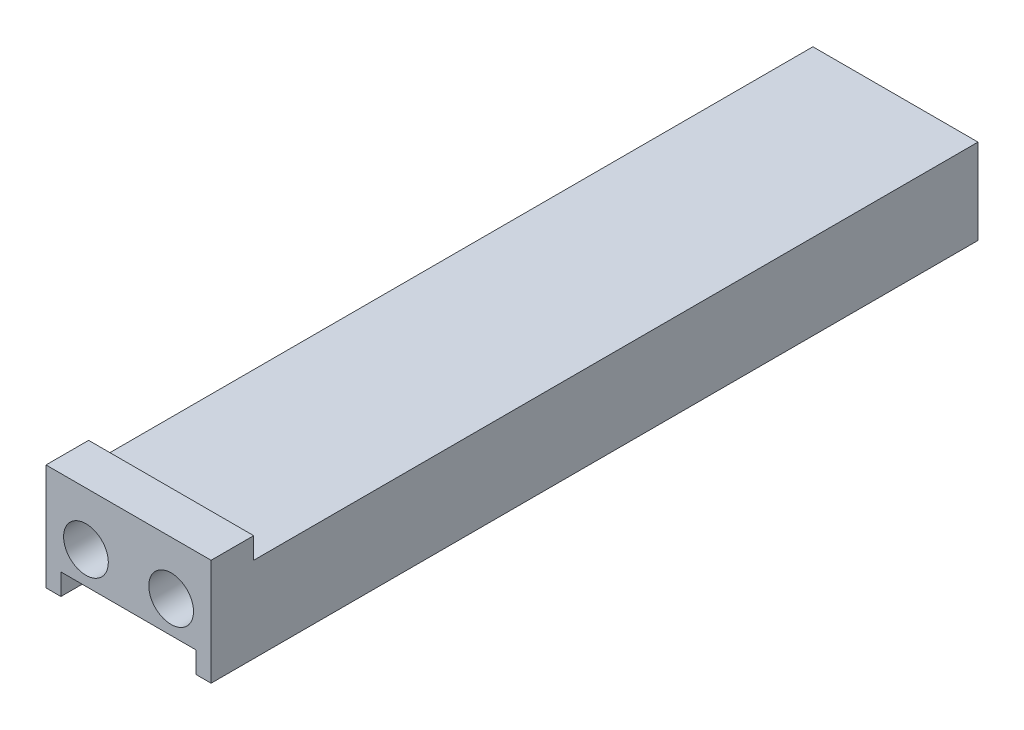
ISO-10303-21;
HEADER;
FILE_DESCRIPTION(('STEP AP214'),'2;1');
FILE_NAME('part.step','',(''),(''),'','','');
FILE_SCHEMA(('AUTOMOTIVE_DESIGN { 1 0 10303 214 1 1 1 1 }'));
ENDSEC;
DATA;
#1=APPLICATION_CONTEXT('core data for automotive mechanical design processes');
#2=APPLICATION_PROTOCOL_DEFINITION('international standard','automotive_design',2000,#1);
#3=PRODUCT_CONTEXT('',#1,'mechanical');
#4=PRODUCT('Part','Part','',(#3));
#5=PRODUCT_RELATED_PRODUCT_CATEGORY('part','',(#4));
#6=PRODUCT_DEFINITION_FORMATION('','',#4);
#7=PRODUCT_DEFINITION_CONTEXT('part definition',#1,'design');
#8=PRODUCT_DEFINITION('design','',#6,#7);
#9=PRODUCT_DEFINITION_SHAPE('','',#8);
#10=(LENGTH_UNIT() NAMED_UNIT(*) SI_UNIT(.MILLI.,.METRE.));
#11=(NAMED_UNIT(*) PLANE_ANGLE_UNIT() SI_UNIT($,.RADIAN.));
#12=(NAMED_UNIT(*) SI_UNIT($,.STERADIAN.) SOLID_ANGLE_UNIT());
#13=UNCERTAINTY_MEASURE_WITH_UNIT(LENGTH_MEASURE(1.E-05),#10,'distance_accuracy_value','');
#14=(GEOMETRIC_REPRESENTATION_CONTEXT(3) GLOBAL_UNCERTAINTY_ASSIGNED_CONTEXT((#13)) GLOBAL_UNIT_ASSIGNED_CONTEXT((#10,
#11,#12)) REPRESENTATION_CONTEXT('',''));
#15=CARTESIAN_POINT('',(0.,0.,0.));
#16=DIRECTION('',(0.,0.,1.));
#17=DIRECTION('',(1.,0.,0.));
#18=AXIS2_PLACEMENT_3D('',#15,#16,#17);
#19=CARTESIAN_POINT('',(0.,8.,72.));
#20=DIRECTION('',(0.,-1.,0.));
#21=DIRECTION('',(0.,0.,-1.));
#22=AXIS2_PLACEMENT_3D('',#19,#20,#21);
#23=PLANE('',#22);
#24=DIRECTION('',(-1.,0.,0.));
#25=VECTOR('',#24,1.);
#26=CARTESIAN_POINT('',(0.,8.,68.));
#27=LINE('',#26,#25);
#28=CARTESIAN_POINT('',(15.5,8.,68.));
#29=VERTEX_POINT('',#28);
#30=CARTESIAN_POINT('',(0.,8.,68.));
#31=VERTEX_POINT('',#30);
#32=EDGE_CURVE('E50',#29,#31,#27,.T.);
#33=ORIENTED_EDGE('',*,*,#32,.F.);
#34=DIRECTION('',(0.,0.,-1.));
#35=VECTOR('',#34,1.);
#36=CARTESIAN_POINT('',(15.5,8.,72.));
#37=LINE('',#36,#35);
#38=CARTESIAN_POINT('',(15.5,8.,0.));
#39=VERTEX_POINT('',#38);
#40=EDGE_CURVE('E155',#29,#39,#37,.T.);
#41=ORIENTED_EDGE('',*,*,#40,.T.);
#42=DIRECTION('',(-1.,0.,0.));
#43=VECTOR('',#42,1.);
#44=CARTESIAN_POINT('',(0.,8.,0.));
#45=LINE('',#44,#43);
#46=CARTESIAN_POINT('',(0.,8.,0.));
#47=VERTEX_POINT('',#46);
#48=EDGE_CURVE('E123',#39,#47,#45,.T.);
#49=ORIENTED_EDGE('',*,*,#48,.T.);
#50=DIRECTION('',(0.,0.,-1.));
#51=VECTOR('',#50,1.);
#52=CARTESIAN_POINT('',(0.,8.,72.));
#53=LINE('',#52,#51);
#54=EDGE_CURVE('E188',#31,#47,#53,.T.);
#55=ORIENTED_EDGE('',*,*,#54,.F.);
#56=EDGE_LOOP('',(#33,#41,#49,#55));
#57=FACE_BOUND('',#56,.T.);
#58=ADVANCED_FACE('F33',(#57),#23,.F.);
#59=CARTESIAN_POINT('',(0.,0.,72.));
#60=DIRECTION('',(0.,1.,0.));
#61=DIRECTION('',(0.,0.,1.));
#62=AXIS2_PLACEMENT_3D('',#59,#60,#61);
#63=PLANE('',#62);
#64=DIRECTION('',(1.,0.,0.));
#65=VECTOR('',#64,1.);
#66=CARTESIAN_POINT('',(0.,0.,72.));
#67=LINE('',#66,#65);
#68=CARTESIAN_POINT('',(14.1,0.,72.));
#69=VERTEX_POINT('',#68);
#70=CARTESIAN_POINT('',(15.5,0.,72.));
#71=VERTEX_POINT('',#70);
#72=EDGE_CURVE('E122',#69,#71,#67,.T.);
#73=ORIENTED_EDGE('',*,*,#72,.F.);
#74=DIRECTION('',(0.,0.,-1.));
#75=VECTOR('',#74,1.);
#76=CARTESIAN_POINT('',(14.1,0.,72.));
#77=LINE('',#76,#75);
#78=CARTESIAN_POINT('',(14.1,0.,0.));
#79=VERTEX_POINT('',#78);
#80=EDGE_CURVE('E183',#69,#79,#77,.T.);
#81=ORIENTED_EDGE('',*,*,#80,.T.);
#82=DIRECTION('',(1.,0.,0.));
#83=VECTOR('',#82,1.);
#84=CARTESIAN_POINT('',(0.,0.,0.));
#85=LINE('',#84,#83);
#86=CARTESIAN_POINT('',(15.5,0.,0.));
#87=VERTEX_POINT('',#86);
#88=EDGE_CURVE('E190',#79,#87,#85,.T.);
#89=ORIENTED_EDGE('',*,*,#88,.T.);
#90=DIRECTION('',(0.,0.,-1.));
#91=VECTOR('',#90,1.);
#92=CARTESIAN_POINT('',(15.5,0.,72.));
#93=LINE('',#92,#91);
#94=EDGE_CURVE('E42',#71,#87,#93,.T.);
#95=ORIENTED_EDGE('',*,*,#94,.F.);
#96=EDGE_LOOP('',(#73,#81,#89,#95));
#97=FACE_BOUND('',#96,.T.);
#98=ADVANCED_FACE('F226',(#97),#63,.F.);
#99=CARTESIAN_POINT('',(0.,0.,72.));
#100=DIRECTION('',(1.,0.,0.));
#101=DIRECTION('',(0.,0.,-1.));
#102=AXIS2_PLACEMENT_3D('',#99,#100,#101);
#103=PLANE('',#102);
#104=DIRECTION('',(0.,-1.,0.));
#105=VECTOR('',#104,1.);
#106=CARTESIAN_POINT('',(0.,0.,0.));
#107=LINE('',#106,#105);
#108=CARTESIAN_POINT('',(0.,0.,0.));
#109=VERTEX_POINT('',#108);
#110=EDGE_CURVE('E179',#47,#109,#107,.T.);
#111=ORIENTED_EDGE('',*,*,#110,.T.);
#112=DIRECTION('',(0.,0.,-1.));
#113=VECTOR('',#112,1.);
#114=CARTESIAN_POINT('',(0.,0.,72.));
#115=LINE('',#114,#113);
#116=CARTESIAN_POINT('',(0.,0.,72.));
#117=VERTEX_POINT('',#116);
#118=EDGE_CURVE('E11',#117,#109,#115,.T.);
#119=ORIENTED_EDGE('',*,*,#118,.F.);
#120=DIRECTION('',(0.,-1.,0.));
#121=VECTOR('',#120,1.);
#122=CARTESIAN_POINT('',(0.,0.,72.));
#123=LINE('',#122,#121);
#124=CARTESIAN_POINT('',(0.,10.,72.));
#125=VERTEX_POINT('',#124);
#126=EDGE_CURVE('E114',#125,#117,#123,.T.);
#127=ORIENTED_EDGE('',*,*,#126,.F.);
#128=DIRECTION('',(0.,0.,1.));
#129=VECTOR('',#128,1.);
#130=CARTESIAN_POINT('',(0.,10.,72.));
#131=LINE('',#130,#129);
#132=CARTESIAN_POINT('',(0.,10.,68.));
#133=VERTEX_POINT('',#132);
#134=EDGE_CURVE('E119',#133,#125,#131,.T.);
#135=ORIENTED_EDGE('',*,*,#134,.F.);
#136=DIRECTION('',(0.,-1.,0.));
#137=VECTOR('',#136,1.);
#138=CARTESIAN_POINT('',(0.,10.,68.));
#139=LINE('',#138,#137);
#140=EDGE_CURVE('E148',#133,#31,#139,.T.);
#141=ORIENTED_EDGE('',*,*,#140,.T.);
#142=ORIENTED_EDGE('',*,*,#54,.T.);
#143=EDGE_LOOP('',(#111,#119,#127,#135,#141,#142));
#144=FACE_BOUND('',#143,.T.);
#145=ADVANCED_FACE('F35',(#144),#103,.F.);
#146=CARTESIAN_POINT('',(1.4,0.,0.));
#147=VERTEX_POINT('',#146);
#148=EDGE_CURVE('E191',#109,#147,#85,.T.);
#149=ORIENTED_EDGE('',*,*,#148,.T.);
#150=DIRECTION('',(0.,0.,-1.));
#151=VECTOR('',#150,1.);
#152=CARTESIAN_POINT('',(1.4,0.,72.));
#153=LINE('',#152,#151);
#154=CARTESIAN_POINT('',(1.4,0.,72.));
#155=VERTEX_POINT('',#154);
#156=EDGE_CURVE('E58',#155,#147,#153,.T.);
#157=ORIENTED_EDGE('',*,*,#156,.F.);
#158=EDGE_CURVE('E185',#117,#155,#67,.T.);
#159=ORIENTED_EDGE('',*,*,#158,.F.);
#160=ORIENTED_EDGE('',*,*,#118,.T.);
#161=EDGE_LOOP('',(#149,#157,#159,#160));
#162=FACE_BOUND('',#161,.T.);
#163=ADVANCED_FACE('F232',(#162),#63,.F.);
#164=CARTESIAN_POINT('',(15.5,0.,72.));
#165=DIRECTION('',(-1.,0.,0.));
#166=DIRECTION('',(0.,0.,1.));
#167=AXIS2_PLACEMENT_3D('',#164,#165,#166);
#168=PLANE('',#167);
#169=DIRECTION('',(0.,1.,0.));
#170=VECTOR('',#169,1.);
#171=CARTESIAN_POINT('',(15.5,0.,0.));
#172=LINE('',#171,#170);
#173=EDGE_CURVE('E194',#87,#39,#172,.T.);
#174=ORIENTED_EDGE('',*,*,#173,.T.);
#175=ORIENTED_EDGE('',*,*,#40,.F.);
#176=DIRECTION('',(0.,-1.,0.));
#177=VECTOR('',#176,1.);
#178=CARTESIAN_POINT('',(15.5,10.,68.));
#179=LINE('',#178,#177);
#180=CARTESIAN_POINT('',(15.5,10.,68.));
#181=VERTEX_POINT('',#180);
#182=EDGE_CURVE('E159',#181,#29,#179,.T.);
#183=ORIENTED_EDGE('',*,*,#182,.F.);
#184=DIRECTION('',(0.,0.,-1.));
#185=VECTOR('',#184,1.);
#186=CARTESIAN_POINT('',(15.5,10.,72.));
#187=LINE('',#186,#185);
#188=CARTESIAN_POINT('',(15.5,10.,72.));
#189=VERTEX_POINT('',#188);
#190=EDGE_CURVE('E133',#189,#181,#187,.T.);
#191=ORIENTED_EDGE('',*,*,#190,.F.);
#192=DIRECTION('',(0.,1.,0.));
#193=VECTOR('',#192,1.);
#194=CARTESIAN_POINT('',(15.5,0.,72.));
#195=LINE('',#194,#193);
#196=EDGE_CURVE('E130',#71,#189,#195,.T.);
#197=ORIENTED_EDGE('',*,*,#196,.F.);
#198=ORIENTED_EDGE('',*,*,#94,.T.);
#199=EDGE_LOOP('',(#174,#175,#183,#191,#197,#198));
#200=FACE_BOUND('',#199,.T.);
#201=ADVANCED_FACE('F208',(#200),#168,.F.);
#202=CARTESIAN_POINT('',(0.,8.,72.));
#203=DIRECTION('',(0.,0.,-1.));
#204=DIRECTION('',(-1.,0.,0.));
#205=AXIS2_PLACEMENT_3D('',#202,#203,#204);
#206=PLANE('',#205);
#207=CARTESIAN_POINT('',(11.75,5.,72.));
#208=DIRECTION('',(0.,0.,1.));
#209=DIRECTION('',(-1.,0.,0.));
#210=AXIS2_PLACEMENT_3D('',#207,#208,#209);
#211=CIRCLE('',#210,2.1);
#212=CARTESIAN_POINT('',(9.65,5.,72.));
#213=VERTEX_POINT('',#212);
#214=EDGE_CURVE('E264',#213,#213,#211,.T.);
#215=ORIENTED_EDGE('',*,*,#214,.F.);
#216=EDGE_LOOP('',(#215));
#217=FACE_BOUND('',#216,.T.);
#218=CARTESIAN_POINT('',(3.75,5.,72.));
#219=DIRECTION('',(0.,0.,1.));
#220=DIRECTION('',(1.,0.,0.));
#221=AXIS2_PLACEMENT_3D('',#218,#219,#220);
#222=CIRCLE('',#221,2.1);
#223=CARTESIAN_POINT('',(5.85,5.,72.));
#224=VERTEX_POINT('',#223);
#225=EDGE_CURVE('E143',#224,#224,#222,.T.);
#226=ORIENTED_EDGE('',*,*,#225,.F.);
#227=EDGE_LOOP('',(#226));
#228=FACE_BOUND('',#227,.T.);
#229=DIRECTION('',(1.,0.,0.));
#230=VECTOR('',#229,1.);
#231=CARTESIAN_POINT('',(14.1,2.,72.));
#232=LINE('',#231,#230);
#233=CARTESIAN_POINT('',(1.4,2.,72.));
#234=VERTEX_POINT('',#233);
#235=CARTESIAN_POINT('',(14.1,2.,72.));
#236=VERTEX_POINT('',#235);
#237=EDGE_CURVE('E173',#234,#236,#232,.T.);
#238=ORIENTED_EDGE('',*,*,#237,.T.);
#239=DIRECTION('',(0.,-1.,0.));
#240=VECTOR('',#239,1.);
#241=CARTESIAN_POINT('',(14.1,0.,72.));
#242=LINE('',#241,#240);
#243=EDGE_CURVE('E151',#236,#69,#242,.T.);
#244=ORIENTED_EDGE('',*,*,#243,.T.);
#245=ORIENTED_EDGE('',*,*,#72,.T.);
#246=ORIENTED_EDGE('',*,*,#196,.T.);
#247=DIRECTION('',(1.,0.,0.));
#248=VECTOR('',#247,1.);
#249=CARTESIAN_POINT('',(0.,10.,72.));
#250=LINE('',#249,#248);
#251=EDGE_CURVE('E126',#125,#189,#250,.T.);
#252=ORIENTED_EDGE('',*,*,#251,.F.);
#253=ORIENTED_EDGE('',*,*,#126,.T.);
#254=ORIENTED_EDGE('',*,*,#158,.T.);
#255=DIRECTION('',(0.,1.,0.));
#256=VECTOR('',#255,1.);
#257=CARTESIAN_POINT('',(1.4,0.,72.));
#258=LINE('',#257,#256);
#259=EDGE_CURVE('E243',#155,#234,#258,.T.);
#260=ORIENTED_EDGE('',*,*,#259,.T.);
#261=EDGE_LOOP('',(#238,#244,#245,#246,#252,#253,#254,#260));
#262=FACE_BOUND('',#261,.T.);
#263=ADVANCED_FACE('F128',(#217,#228,#262),#206,.F.);
#264=CARTESIAN_POINT('',(0.,8.,0.));
#265=DIRECTION('',(0.,0.,-1.));
#266=DIRECTION('',(-1.,0.,0.));
#267=AXIS2_PLACEMENT_3D('',#264,#265,#266);
#268=PLANE('',#267);
#269=DIRECTION('',(0.,-1.,0.));
#270=VECTOR('',#269,1.);
#271=CARTESIAN_POINT('',(14.1,0.,0.));
#272=LINE('',#271,#270);
#273=CARTESIAN_POINT('',(14.1,2.,0.));
#274=VERTEX_POINT('',#273);
#275=EDGE_CURVE('E162',#274,#79,#272,.T.);
#276=ORIENTED_EDGE('',*,*,#275,.F.);
#277=DIRECTION('',(1.,0.,0.));
#278=VECTOR('',#277,1.);
#279=CARTESIAN_POINT('',(14.1,2.,0.));
#280=LINE('',#279,#278);
#281=CARTESIAN_POINT('',(1.4,2.,0.));
#282=VERTEX_POINT('',#281);
#283=EDGE_CURVE('E170',#282,#274,#280,.T.);
#284=ORIENTED_EDGE('',*,*,#283,.F.);
#285=DIRECTION('',(0.,1.,0.));
#286=VECTOR('',#285,1.);
#287=CARTESIAN_POINT('',(1.4,0.,0.));
#288=LINE('',#287,#286);
#289=EDGE_CURVE('E165',#147,#282,#288,.T.);
#290=ORIENTED_EDGE('',*,*,#289,.F.);
#291=ORIENTED_EDGE('',*,*,#148,.F.);
#292=ORIENTED_EDGE('',*,*,#110,.F.);
#293=ORIENTED_EDGE('',*,*,#48,.F.);
#294=ORIENTED_EDGE('',*,*,#173,.F.);
#295=ORIENTED_EDGE('',*,*,#88,.F.);
#296=EDGE_LOOP('',(#276,#284,#290,#291,#292,#293,#294,#295));
#297=FACE_BOUND('',#296,.T.);
#298=ADVANCED_FACE('F211',(#297),#268,.T.);
#299=CARTESIAN_POINT('',(14.1,0.,72.));
#300=DIRECTION('',(1.,0.,0.));
#301=DIRECTION('',(0.,0.,-1.));
#302=AXIS2_PLACEMENT_3D('',#299,#300,#301);
#303=PLANE('',#302);
#304=ORIENTED_EDGE('',*,*,#275,.T.);
#305=ORIENTED_EDGE('',*,*,#80,.F.);
#306=ORIENTED_EDGE('',*,*,#243,.F.);
#307=DIRECTION('',(0.,0.,-1.));
#308=VECTOR('',#307,1.);
#309=CARTESIAN_POINT('',(14.1,2.,72.));
#310=LINE('',#309,#308);
#311=EDGE_CURVE('E177',#236,#274,#310,.T.);
#312=ORIENTED_EDGE('',*,*,#311,.T.);
#313=EDGE_LOOP('',(#304,#305,#306,#312));
#314=FACE_BOUND('',#313,.T.);
#315=ADVANCED_FACE('F250',(#314),#303,.F.);
#316=CARTESIAN_POINT('',(14.1,2.,72.));
#317=DIRECTION('',(0.,1.,0.));
#318=DIRECTION('',(0.,0.,1.));
#319=AXIS2_PLACEMENT_3D('',#316,#317,#318);
#320=PLANE('',#319);
#321=ORIENTED_EDGE('',*,*,#283,.T.);
#322=ORIENTED_EDGE('',*,*,#311,.F.);
#323=ORIENTED_EDGE('',*,*,#237,.F.);
#324=DIRECTION('',(0.,0.,-1.));
#325=VECTOR('',#324,1.);
#326=CARTESIAN_POINT('',(1.4,2.,72.));
#327=LINE('',#326,#325);
#328=EDGE_CURVE('E180',#234,#282,#327,.T.);
#329=ORIENTED_EDGE('',*,*,#328,.T.);
#330=EDGE_LOOP('',(#321,#322,#323,#329));
#331=FACE_BOUND('',#330,.T.);
#332=ADVANCED_FACE('F222',(#331),#320,.F.);
#333=CARTESIAN_POINT('',(1.4,0.,72.));
#334=DIRECTION('',(-1.,0.,0.));
#335=DIRECTION('',(0.,0.,1.));
#336=AXIS2_PLACEMENT_3D('',#333,#334,#335);
#337=PLANE('',#336);
#338=ORIENTED_EDGE('',*,*,#289,.T.);
#339=ORIENTED_EDGE('',*,*,#328,.F.);
#340=ORIENTED_EDGE('',*,*,#259,.F.);
#341=ORIENTED_EDGE('',*,*,#156,.T.);
#342=EDGE_LOOP('',(#338,#339,#340,#341));
#343=FACE_BOUND('',#342,.T.);
#344=ADVANCED_FACE('F214',(#343),#337,.F.);
#345=CARTESIAN_POINT('',(0.,10.,68.));
#346=DIRECTION('',(0.,0.,1.));
#347=DIRECTION('',(1.,0.,0.));
#348=AXIS2_PLACEMENT_3D('',#345,#346,#347);
#349=PLANE('',#348);
#350=ORIENTED_EDGE('',*,*,#32,.T.);
#351=ORIENTED_EDGE('',*,*,#140,.F.);
#352=DIRECTION('',(-1.,0.,0.));
#353=VECTOR('',#352,1.);
#354=CARTESIAN_POINT('',(0.,10.,68.));
#355=LINE('',#354,#353);
#356=EDGE_CURVE('E137',#181,#133,#355,.T.);
#357=ORIENTED_EDGE('',*,*,#356,.F.);
#358=ORIENTED_EDGE('',*,*,#182,.T.);
#359=EDGE_LOOP('',(#350,#351,#357,#358));
#360=FACE_BOUND('',#359,.T.);
#361=ADVANCED_FACE('F212',(#360),#349,.F.);
#362=CARTESIAN_POINT('',(0.,10.,68.));
#363=DIRECTION('',(0.,-1.,0.));
#364=DIRECTION('',(0.,0.,-1.));
#365=AXIS2_PLACEMENT_3D('',#362,#363,#364);
#366=PLANE('',#365);
#367=ORIENTED_EDGE('',*,*,#134,.T.);
#368=ORIENTED_EDGE('',*,*,#251,.T.);
#369=ORIENTED_EDGE('',*,*,#190,.T.);
#370=ORIENTED_EDGE('',*,*,#356,.T.);
#371=EDGE_LOOP('',(#367,#368,#369,#370));
#372=FACE_BOUND('',#371,.T.);
#373=ADVANCED_FACE('F135',(#372),#366,.F.);
#374=CARTESIAN_POINT('',(3.75,5.,62.));
#375=DIRECTION('',(0.,0.,1.));
#376=DIRECTION('',(1.,0.,0.));
#377=AXIS2_PLACEMENT_3D('',#374,#375,#376);
#378=CYLINDRICAL_SURFACE('',#377,2.1);
#379=CARTESIAN_POINT('',(3.75,5.,62.));
#380=DIRECTION('',(0.,0.,1.));
#381=DIRECTION('',(1.,0.,0.));
#382=AXIS2_PLACEMENT_3D('',#379,#380,#381);
#383=CIRCLE('',#382,2.1);
#384=CARTESIAN_POINT('',(5.85,5.,62.));
#385=VERTEX_POINT('',#384);
#386=EDGE_CURVE('E140',#385,#385,#383,.T.);
#387=ORIENTED_EDGE('',*,*,#386,.F.);
#388=EDGE_LOOP('',(#387));
#389=FACE_BOUND('',#388,.T.);
#390=ORIENTED_EDGE('',*,*,#225,.T.);
#391=EDGE_LOOP('',(#390));
#392=FACE_BOUND('',#391,.T.);
#393=ADVANCED_FACE('F220',(#389,#392),#378,.F.);
#394=CARTESIAN_POINT('',(3.75,5.,62.));
#395=DIRECTION('',(0.,0.,1.));
#396=DIRECTION('',(1.,0.,0.));
#397=AXIS2_PLACEMENT_3D('',#394,#395,#396);
#398=PLANE('',#397);
#399=ORIENTED_EDGE('',*,*,#386,.T.);
#400=EDGE_LOOP('',(#399));
#401=FACE_BOUND('',#400,.T.);
#402=ADVANCED_FACE('F279',(#401),#398,.T.);
#403=CARTESIAN_POINT('',(11.75,5.,62.));
#404=DIRECTION('',(0.,0.,1.));
#405=DIRECTION('',(1.,0.,0.));
#406=AXIS2_PLACEMENT_3D('',#403,#404,#405);
#407=CYLINDRICAL_SURFACE('',#406,2.1);
#408=CARTESIAN_POINT('',(11.75,5.,62.));
#409=DIRECTION('',(0.,0.,1.));
#410=DIRECTION('',(-1.,0.,0.));
#411=AXIS2_PLACEMENT_3D('',#408,#409,#410);
#412=CIRCLE('',#411,2.1);
#413=CARTESIAN_POINT('',(9.65,5.,62.));
#414=VERTEX_POINT('',#413);
#415=EDGE_CURVE('E268',#414,#414,#412,.T.);
#416=ORIENTED_EDGE('',*,*,#415,.F.);
#417=EDGE_LOOP('',(#416));
#418=FACE_BOUND('',#417,.T.);
#419=ORIENTED_EDGE('',*,*,#214,.T.);
#420=EDGE_LOOP('',(#419));
#421=FACE_BOUND('',#420,.T.);
#422=ADVANCED_FACE('F276',(#418,#421),#407,.F.);
#423=CARTESIAN_POINT('',(11.75,5.,62.));
#424=DIRECTION('',(0.,0.,-1.));
#425=DIRECTION('',(-1.,0.,0.));
#426=AXIS2_PLACEMENT_3D('',#423,#424,#425);
#427=PLANE('',#426);
#428=ORIENTED_EDGE('',*,*,#415,.T.);
#429=EDGE_LOOP('',(#428));
#430=FACE_BOUND('',#429,.T.);
#431=ADVANCED_FACE('F278',(#430),#427,.F.);
#432=CLOSED_SHELL('',(#58,#98,#145,#163,#201,#263,#298,#315,#332,#344,#361,#373,#393,#402,#422,#431));
#433=MANIFOLD_SOLID_BREP('B2',#432);
#434=ADVANCED_BREP_SHAPE_REPRESENTATION('',(#18,#433),#14);
#435=SHAPE_DEFINITION_REPRESENTATION(#9,#434);
ENDSEC;
END-ISO-10303-21;
